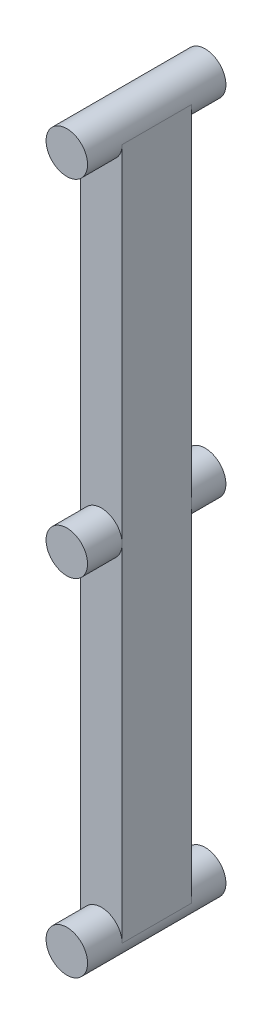
ISO-10303-21;
HEADER;
FILE_DESCRIPTION(('STEP AP214'),'2;1');
FILE_NAME('part.step','',(''),(''),'','','');
FILE_SCHEMA(('AUTOMOTIVE_DESIGN { 1 0 10303 214 1 1 1 1 }'));
ENDSEC;
DATA;
#1=APPLICATION_CONTEXT('core data for automotive mechanical design processes');
#2=APPLICATION_PROTOCOL_DEFINITION('international standard','automotive_design',2000,#1);
#3=PRODUCT_CONTEXT('',#1,'mechanical');
#4=PRODUCT('Part','Part','',(#3));
#5=PRODUCT_RELATED_PRODUCT_CATEGORY('part','',(#4));
#6=PRODUCT_DEFINITION_FORMATION('','',#4);
#7=PRODUCT_DEFINITION_CONTEXT('part definition',#1,'design');
#8=PRODUCT_DEFINITION('design','',#6,#7);
#9=PRODUCT_DEFINITION_SHAPE('','',#8);
#10=(LENGTH_UNIT() NAMED_UNIT(*) SI_UNIT(.MILLI.,.METRE.));
#11=(NAMED_UNIT(*) PLANE_ANGLE_UNIT() SI_UNIT($,.RADIAN.));
#12=(NAMED_UNIT(*) SI_UNIT($,.STERADIAN.) SOLID_ANGLE_UNIT());
#13=UNCERTAINTY_MEASURE_WITH_UNIT(LENGTH_MEASURE(1.E-05),#10,'distance_accuracy_value','');
#14=(GEOMETRIC_REPRESENTATION_CONTEXT(3) GLOBAL_UNCERTAINTY_ASSIGNED_CONTEXT((#13)) GLOBAL_UNIT_ASSIGNED_CONTEXT((#10,
#11,#12)) REPRESENTATION_CONTEXT('',''));
#15=CARTESIAN_POINT('',(0.,0.,0.));
#16=DIRECTION('',(0.,0.,1.));
#17=DIRECTION('',(1.,0.,0.));
#18=AXIS2_PLACEMENT_3D('',#15,#16,#17);
#19=CARTESIAN_POINT('',(0.,0.,-2.5));
#20=DIRECTION('',(0.,0.,-1.));
#21=DIRECTION('',(-1.,0.,0.));
#22=AXIS2_PLACEMENT_3D('',#19,#20,#21);
#23=PLANE('',#22);
#24=CARTESIAN_POINT('',(0.,25.,-2.5));
#25=DIRECTION('',(0.,0.,-1.));
#26=DIRECTION('',(-1.,0.,0.));
#27=AXIS2_PLACEMENT_3D('',#24,#25,#26);
#28=CIRCLE('',#27,1.5);
#29=CARTESIAN_POINT('',(1.5,25.,-2.5));
#30=VERTEX_POINT('',#29);
#31=CARTESIAN_POINT('',(-1.5,25.,-2.5));
#32=VERTEX_POINT('',#31);
#33=EDGE_CURVE('E87',#30,#32,#28,.T.);
#34=ORIENTED_EDGE('',*,*,#33,.F.);
#35=DIRECTION('',(0.,1.,0.));
#36=VECTOR('',#35,1.);
#37=CARTESIAN_POINT('',(1.5,-25.,-2.5));
#38=LINE('',#37,#36);
#39=CARTESIAN_POINT('',(1.5,0.,-2.5));
#40=VERTEX_POINT('',#39);
#41=EDGE_CURVE('E100',#40,#30,#38,.T.);
#42=ORIENTED_EDGE('',*,*,#41,.F.);
#43=CARTESIAN_POINT('',(0.,0.,-2.5));
#44=DIRECTION('',(0.,0.,-1.));
#45=DIRECTION('',(-1.,0.,0.));
#46=AXIS2_PLACEMENT_3D('',#43,#44,#45);
#47=CIRCLE('',#46,1.5);
#48=CARTESIAN_POINT('',(-1.5,0.,-2.5));
#49=VERTEX_POINT('',#48);
#50=EDGE_CURVE('E138',#49,#40,#47,.T.);
#51=ORIENTED_EDGE('',*,*,#50,.F.);
#52=DIRECTION('',(0.,1.,0.));
#53=VECTOR('',#52,1.);
#54=CARTESIAN_POINT('',(-1.5,-25.,-2.5));
#55=LINE('',#54,#53);
#56=EDGE_CURVE('E103',#49,#32,#55,.T.);
#57=ORIENTED_EDGE('',*,*,#56,.T.);
#58=EDGE_LOOP('',(#34,#42,#51,#57));
#59=FACE_BOUND('',#58,.T.);
#60=ADVANCED_FACE('F32',(#59),#23,.T.);
#61=CARTESIAN_POINT('',(0.,0.,2.5));
#62=DIRECTION('',(0.,0.,-1.));
#63=DIRECTION('',(-1.,0.,0.));
#64=AXIS2_PLACEMENT_3D('',#61,#62,#63);
#65=PLANE('',#64);
#66=DIRECTION('',(0.,1.,0.));
#67=VECTOR('',#66,1.);
#68=CARTESIAN_POINT('',(1.5,-25.,2.5));
#69=LINE('',#68,#67);
#70=CARTESIAN_POINT('',(1.5,0.,2.5));
#71=VERTEX_POINT('',#70);
#72=CARTESIAN_POINT('',(1.5,25.,2.5));
#73=VERTEX_POINT('',#72);
#74=EDGE_CURVE('E127',#71,#73,#69,.T.);
#75=ORIENTED_EDGE('',*,*,#74,.T.);
#76=CARTESIAN_POINT('',(0.,25.,2.5));
#77=DIRECTION('',(0.,0.,-1.));
#78=DIRECTION('',(-1.,0.,0.));
#79=AXIS2_PLACEMENT_3D('',#76,#77,#78);
#80=CIRCLE('',#79,1.5);
#81=CARTESIAN_POINT('',(-1.5,25.,2.5));
#82=VERTEX_POINT('',#81);
#83=EDGE_CURVE('E90',#73,#82,#80,.T.);
#84=ORIENTED_EDGE('',*,*,#83,.T.);
#85=DIRECTION('',(0.,1.,0.));
#86=VECTOR('',#85,1.);
#87=CARTESIAN_POINT('',(-1.5,-25.,2.5));
#88=LINE('',#87,#86);
#89=CARTESIAN_POINT('',(-1.5,0.,2.5));
#90=VERTEX_POINT('',#89);
#91=EDGE_CURVE('E129',#90,#82,#88,.T.);
#92=ORIENTED_EDGE('',*,*,#91,.F.);
#93=CARTESIAN_POINT('',(0.,0.,2.5));
#94=DIRECTION('',(0.,0.,-1.));
#95=DIRECTION('',(-1.,0.,0.));
#96=AXIS2_PLACEMENT_3D('',#93,#94,#95);
#97=CIRCLE('',#96,1.5);
#98=EDGE_CURVE('E40',#90,#71,#97,.T.);
#99=ORIENTED_EDGE('',*,*,#98,.T.);
#100=EDGE_LOOP('',(#75,#84,#92,#99));
#101=FACE_BOUND('',#100,.T.);
#102=ADVANCED_FACE('F126',(#101),#65,.F.);
#103=CARTESIAN_POINT('',(-1.5,-25.,-2.5));
#104=DIRECTION('',(1.,0.,0.));
#105=DIRECTION('',(0.,0.,-1.));
#106=AXIS2_PLACEMENT_3D('',#103,#104,#105);
#107=PLANE('',#106);
#108=ORIENTED_EDGE('',*,*,#56,.F.);
#109=CARTESIAN_POINT('',(-1.5,-25.,-2.5));
#110=VERTEX_POINT('',#109);
#111=EDGE_CURVE('E111',#110,#49,#55,.T.);
#112=ORIENTED_EDGE('',*,*,#111,.F.);
#113=DIRECTION('',(0.,0.,1.));
#114=VECTOR('',#113,1.);
#115=CARTESIAN_POINT('',(-1.5,-25.,-2.5));
#116=LINE('',#115,#114);
#117=CARTESIAN_POINT('',(-1.5,-25.,2.5));
#118=VERTEX_POINT('',#117);
#119=EDGE_CURVE('E113',#110,#118,#116,.T.);
#120=ORIENTED_EDGE('',*,*,#119,.T.);
#121=EDGE_CURVE('E133',#118,#90,#88,.T.);
#122=ORIENTED_EDGE('',*,*,#121,.T.);
#123=ORIENTED_EDGE('',*,*,#91,.T.);
#124=DIRECTION('',(0.,0.,1.));
#125=VECTOR('',#124,1.);
#126=CARTESIAN_POINT('',(-1.5,25.,-2.5));
#127=LINE('',#126,#125);
#128=EDGE_CURVE('E95',#32,#82,#127,.T.);
#129=ORIENTED_EDGE('',*,*,#128,.F.);
#130=EDGE_LOOP('',(#108,#112,#120,#122,#123,#129));
#131=FACE_BOUND('',#130,.T.);
#132=ADVANCED_FACE('F34',(#131),#107,.F.);
#133=CARTESIAN_POINT('',(1.5,-25.,-2.5));
#134=DIRECTION('',(1.,0.,0.));
#135=DIRECTION('',(0.,0.,-1.));
#136=AXIS2_PLACEMENT_3D('',#133,#134,#135);
#137=PLANE('',#136);
#138=ORIENTED_EDGE('',*,*,#74,.F.);
#139=CARTESIAN_POINT('',(1.5,-25.,2.5));
#140=VERTEX_POINT('',#139);
#141=EDGE_CURVE('E132',#140,#71,#69,.T.);
#142=ORIENTED_EDGE('',*,*,#141,.F.);
#143=DIRECTION('',(0.,0.,1.));
#144=VECTOR('',#143,1.);
#145=CARTESIAN_POINT('',(1.5,-25.,-2.5));
#146=LINE('',#145,#144);
#147=CARTESIAN_POINT('',(1.5,-25.,-2.5));
#148=VERTEX_POINT('',#147);
#149=EDGE_CURVE('E96',#148,#140,#146,.T.);
#150=ORIENTED_EDGE('',*,*,#149,.F.);
#151=EDGE_CURVE('E109',#148,#40,#38,.T.);
#152=ORIENTED_EDGE('',*,*,#151,.T.);
#153=ORIENTED_EDGE('',*,*,#41,.T.);
#154=DIRECTION('',(0.,0.,1.));
#155=VECTOR('',#154,1.);
#156=CARTESIAN_POINT('',(1.5,25.,-2.5));
#157=LINE('',#156,#155);
#158=EDGE_CURVE('E84',#30,#73,#157,.T.);
#159=ORIENTED_EDGE('',*,*,#158,.T.);
#160=EDGE_LOOP('',(#138,#142,#150,#152,#153,#159));
#161=FACE_BOUND('',#160,.T.);
#162=ADVANCED_FACE('F107',(#161),#137,.T.);
#163=CARTESIAN_POINT('',(0.,-25.,-2.5));
#164=DIRECTION('',(0.,0.,-1.));
#165=DIRECTION('',(-1.,0.,0.));
#166=AXIS2_PLACEMENT_3D('',#163,#164,#165);
#167=CIRCLE('',#166,1.5);
#168=EDGE_CURVE('E145',#110,#148,#167,.T.);
#169=ORIENTED_EDGE('',*,*,#168,.F.);
#170=ORIENTED_EDGE('',*,*,#111,.T.);
#171=EDGE_CURVE('E47',#40,#49,#47,.T.);
#172=ORIENTED_EDGE('',*,*,#171,.F.);
#173=ORIENTED_EDGE('',*,*,#151,.F.);
#174=EDGE_LOOP('',(#169,#170,#172,#173));
#175=FACE_BOUND('',#174,.T.);
#176=ADVANCED_FACE('F176',(#175),#23,.T.);
#177=ORIENTED_EDGE('',*,*,#121,.F.);
#178=CARTESIAN_POINT('',(0.,-25.,2.5));
#179=DIRECTION('',(0.,0.,-1.));
#180=DIRECTION('',(-1.,0.,0.));
#181=AXIS2_PLACEMENT_3D('',#178,#179,#180);
#182=CIRCLE('',#181,1.5);
#183=EDGE_CURVE('E11',#118,#140,#182,.T.);
#184=ORIENTED_EDGE('',*,*,#183,.T.);
#185=ORIENTED_EDGE('',*,*,#141,.T.);
#186=EDGE_CURVE('E120',#71,#90,#97,.T.);
#187=ORIENTED_EDGE('',*,*,#186,.T.);
#188=EDGE_LOOP('',(#177,#184,#185,#187));
#189=FACE_BOUND('',#188,.T.);
#190=ADVANCED_FACE('F134',(#189),#65,.F.);
#191=CARTESIAN_POINT('',(0.,0.,5.));
#192=DIRECTION('',(0.,0.,1.));
#193=DIRECTION('',(1.,0.,0.));
#194=AXIS2_PLACEMENT_3D('',#191,#192,#193);
#195=PLANE('',#194);
#196=CARTESIAN_POINT('',(0.,0.,5.));
#197=DIRECTION('',(0.,0.,1.));
#198=DIRECTION('',(1.,0.,0.));
#199=AXIS2_PLACEMENT_3D('',#196,#197,#198);
#200=CIRCLE('',#199,1.5);
#201=CARTESIAN_POINT('',(1.5,0.,5.));
#202=VERTEX_POINT('',#201);
#203=EDGE_CURVE('E142',#202,#202,#200,.T.);
#204=ORIENTED_EDGE('',*,*,#203,.T.);
#205=EDGE_LOOP('',(#204));
#206=FACE_BOUND('',#205,.T.);
#207=ADVANCED_FACE('F186',(#206),#195,.T.);
#208=CARTESIAN_POINT('',(0.,0.,-5.));
#209=DIRECTION('',(0.,0.,1.));
#210=DIRECTION('',(1.,0.,0.));
#211=AXIS2_PLACEMENT_3D('',#208,#209,#210);
#212=CYLINDRICAL_SURFACE('',#211,1.5);
#213=ORIENTED_EDGE('',*,*,#203,.F.);
#214=EDGE_LOOP('',(#213));
#215=FACE_BOUND('',#214,.T.);
#216=ORIENTED_EDGE('',*,*,#98,.F.);
#217=ORIENTED_EDGE('',*,*,#186,.F.);
#218=EDGE_LOOP('',(#216,#217));
#219=FACE_BOUND('',#218,.T.);
#220=ADVANCED_FACE('F196',(#215,#219),#212,.T.);
#221=ORIENTED_EDGE('',*,*,#171,.T.);
#222=ORIENTED_EDGE('',*,*,#50,.T.);
#223=EDGE_LOOP('',(#221,#222));
#224=FACE_BOUND('',#223,.T.);
#225=CARTESIAN_POINT('',(0.,0.,-5.));
#226=DIRECTION('',(0.,0.,1.));
#227=DIRECTION('',(1.,0.,0.));
#228=AXIS2_PLACEMENT_3D('',#225,#226,#227);
#229=CIRCLE('',#228,1.5);
#230=CARTESIAN_POINT('',(1.5,0.,-5.));
#231=VERTEX_POINT('',#230);
#232=EDGE_CURVE('E139',#231,#231,#229,.T.);
#233=ORIENTED_EDGE('',*,*,#232,.T.);
#234=EDGE_LOOP('',(#233));
#235=FACE_BOUND('',#234,.T.);
#236=ADVANCED_FACE('F192',(#224,#235),#212,.T.);
#237=CARTESIAN_POINT('',(0.,0.,-5.));
#238=DIRECTION('',(0.,0.,1.));
#239=DIRECTION('',(1.,0.,0.));
#240=AXIS2_PLACEMENT_3D('',#237,#238,#239);
#241=PLANE('',#240);
#242=ORIENTED_EDGE('',*,*,#232,.F.);
#243=EDGE_LOOP('',(#242));
#244=FACE_BOUND('',#243,.T.);
#245=ADVANCED_FACE('F195',(#244),#241,.F.);
#246=CARTESIAN_POINT('',(0.,-25.,-5.));
#247=DIRECTION('',(0.,0.,1.));
#248=DIRECTION('',(1.,0.,0.));
#249=AXIS2_PLACEMENT_3D('',#246,#247,#248);
#250=CYLINDRICAL_SURFACE('',#249,1.5);
#251=ORIENTED_EDGE('',*,*,#119,.F.);
#252=ORIENTED_EDGE('',*,*,#168,.T.);
#253=ORIENTED_EDGE('',*,*,#149,.T.);
#254=ORIENTED_EDGE('',*,*,#183,.F.);
#255=EDGE_LOOP('',(#251,#252,#253,#254));
#256=FACE_BOUND('',#255,.T.);
#257=CARTESIAN_POINT('',(0.,-25.,-5.));
#258=DIRECTION('',(0.,0.,1.));
#259=DIRECTION('',(1.,0.,0.));
#260=AXIS2_PLACEMENT_3D('',#257,#258,#259);
#261=CIRCLE('',#260,1.5);
#262=CARTESIAN_POINT('',(1.5,-25.,-5.));
#263=VERTEX_POINT('',#262);
#264=EDGE_CURVE('E105',#263,#263,#261,.T.);
#265=ORIENTED_EDGE('',*,*,#264,.T.);
#266=EDGE_LOOP('',(#265));
#267=FACE_BOUND('',#266,.T.);
#268=CARTESIAN_POINT('',(0.,-25.,5.));
#269=DIRECTION('',(0.,0.,1.));
#270=DIRECTION('',(1.,0.,0.));
#271=AXIS2_PLACEMENT_3D('',#268,#269,#270);
#272=CIRCLE('',#271,1.5);
#273=CARTESIAN_POINT('',(1.5,-25.,5.));
#274=VERTEX_POINT('',#273);
#275=EDGE_CURVE('E147',#274,#274,#272,.T.);
#276=ORIENTED_EDGE('',*,*,#275,.F.);
#277=EDGE_LOOP('',(#276));
#278=FACE_BOUND('',#277,.T.);
#279=ADVANCED_FACE('F201',(#256,#267,#278),#250,.T.);
#280=CARTESIAN_POINT('',(0.,-25.,-5.));
#281=DIRECTION('',(0.,0.,1.));
#282=DIRECTION('',(1.,0.,0.));
#283=AXIS2_PLACEMENT_3D('',#280,#281,#282);
#284=PLANE('',#283);
#285=ORIENTED_EDGE('',*,*,#264,.F.);
#286=EDGE_LOOP('',(#285));
#287=FACE_BOUND('',#286,.T.);
#288=ADVANCED_FACE('F206',(#287),#284,.F.);
#289=CARTESIAN_POINT('',(0.,-25.,5.));
#290=DIRECTION('',(0.,0.,1.));
#291=DIRECTION('',(1.,0.,0.));
#292=AXIS2_PLACEMENT_3D('',#289,#290,#291);
#293=PLANE('',#292);
#294=ORIENTED_EDGE('',*,*,#275,.T.);
#295=EDGE_LOOP('',(#294));
#296=FACE_BOUND('',#295,.T.);
#297=ADVANCED_FACE('F171',(#296),#293,.T.);
#298=CARTESIAN_POINT('',(0.,25.,-5.));
#299=DIRECTION('',(0.,0.,1.));
#300=DIRECTION('',(1.,0.,0.));
#301=AXIS2_PLACEMENT_3D('',#298,#299,#300);
#302=CYLINDRICAL_SURFACE('',#301,1.5);
#303=CARTESIAN_POINT('',(0.,25.,5.));
#304=DIRECTION('',(0.,0.,1.));
#305=DIRECTION('',(1.,0.,0.));
#306=AXIS2_PLACEMENT_3D('',#303,#304,#305);
#307=CIRCLE('',#306,1.5);
#308=CARTESIAN_POINT('',(1.5,25.,5.));
#309=VERTEX_POINT('',#308);
#310=EDGE_CURVE('E153',#309,#309,#307,.T.);
#311=ORIENTED_EDGE('',*,*,#310,.F.);
#312=EDGE_LOOP('',(#311));
#313=FACE_BOUND('',#312,.T.);
#314=CARTESIAN_POINT('',(0.,25.,-5.));
#315=DIRECTION('',(0.,0.,1.));
#316=DIRECTION('',(1.,0.,0.));
#317=AXIS2_PLACEMENT_3D('',#314,#315,#316);
#318=CIRCLE('',#317,1.5);
#319=CARTESIAN_POINT('',(1.5,25.,-5.));
#320=VERTEX_POINT('',#319);
#321=EDGE_CURVE('E156',#320,#320,#318,.T.);
#322=ORIENTED_EDGE('',*,*,#321,.T.);
#323=EDGE_LOOP('',(#322));
#324=FACE_BOUND('',#323,.T.);
#325=ORIENTED_EDGE('',*,*,#128,.T.);
#326=ORIENTED_EDGE('',*,*,#83,.F.);
#327=ORIENTED_EDGE('',*,*,#158,.F.);
#328=ORIENTED_EDGE('',*,*,#33,.T.);
#329=EDGE_LOOP('',(#325,#326,#327,#328));
#330=FACE_BOUND('',#329,.T.);
#331=ADVANCED_FACE('F86',(#313,#324,#330),#302,.T.);
#332=CARTESIAN_POINT('',(0.,25.,-5.));
#333=DIRECTION('',(0.,0.,1.));
#334=DIRECTION('',(1.,0.,0.));
#335=AXIS2_PLACEMENT_3D('',#332,#333,#334);
#336=PLANE('',#335);
#337=ORIENTED_EDGE('',*,*,#321,.F.);
#338=EDGE_LOOP('',(#337));
#339=FACE_BOUND('',#338,.T.);
#340=ADVANCED_FACE('F161',(#339),#336,.F.);
#341=CARTESIAN_POINT('',(0.,25.,5.));
#342=DIRECTION('',(0.,0.,1.));
#343=DIRECTION('',(1.,0.,0.));
#344=AXIS2_PLACEMENT_3D('',#341,#342,#343);
#345=PLANE('',#344);
#346=ORIENTED_EDGE('',*,*,#310,.T.);
#347=EDGE_LOOP('',(#346));
#348=FACE_BOUND('',#347,.T.);
#349=ADVANCED_FACE('F163',(#348),#345,.T.);
#350=CLOSED_SHELL('',(#60,#102,#132,#162,#176,#190,#207,#220,#236,#245,#279,#288,#297,#331,#340,#349));
#351=MANIFOLD_SOLID_BREP('B2',#350);
#352=ADVANCED_BREP_SHAPE_REPRESENTATION('',(#18,#351),#14);
#353=SHAPE_DEFINITION_REPRESENTATION(#9,#352);
ENDSEC;
END-ISO-10303-21;
